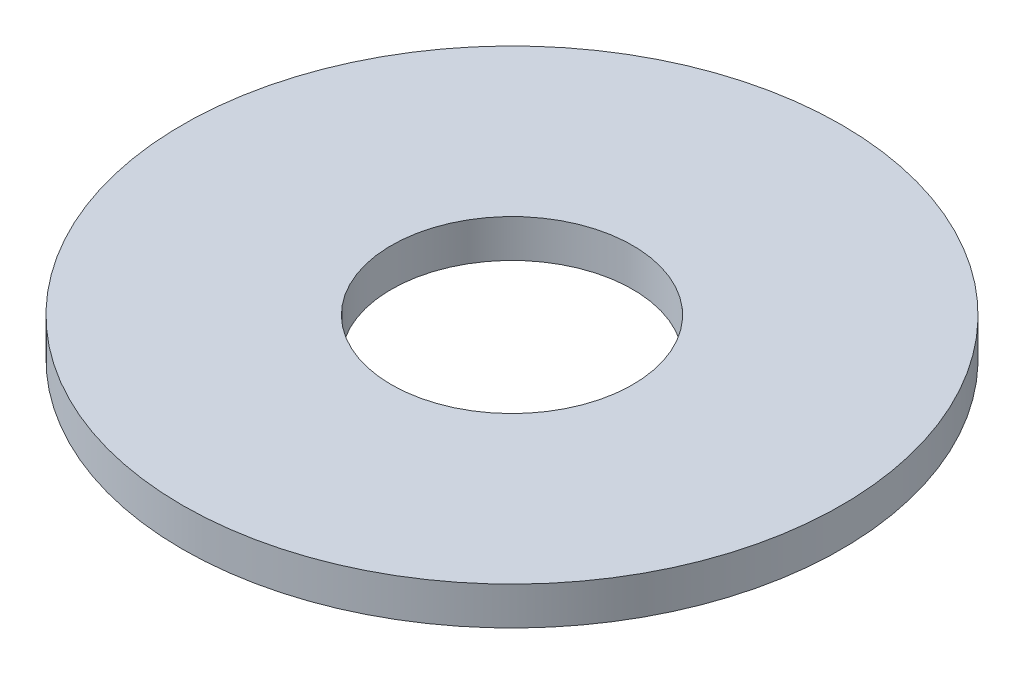
ISO-10303-21;
HEADER;
FILE_DESCRIPTION(('STEP AP214'),'2;1');
FILE_NAME('part.step','',(''),(''),'','','');
FILE_SCHEMA(('AUTOMOTIVE_DESIGN { 1 0 10303 214 1 1 1 1 }'));
ENDSEC;
DATA;
#1=APPLICATION_CONTEXT('core data for automotive mechanical design processes');
#2=APPLICATION_PROTOCOL_DEFINITION('international standard','automotive_design',2000,#1);
#3=PRODUCT_CONTEXT('',#1,'mechanical');
#4=PRODUCT('Part','Part','',(#3));
#5=PRODUCT_RELATED_PRODUCT_CATEGORY('part','',(#4));
#6=PRODUCT_DEFINITION_FORMATION('','',#4);
#7=PRODUCT_DEFINITION_CONTEXT('part definition',#1,'design');
#8=PRODUCT_DEFINITION('design','',#6,#7);
#9=PRODUCT_DEFINITION_SHAPE('','',#8);
#10=(LENGTH_UNIT() NAMED_UNIT(*) SI_UNIT(.MILLI.,.METRE.));
#11=(NAMED_UNIT(*) PLANE_ANGLE_UNIT() SI_UNIT($,.RADIAN.));
#12=(NAMED_UNIT(*) SI_UNIT($,.STERADIAN.) SOLID_ANGLE_UNIT());
#13=UNCERTAINTY_MEASURE_WITH_UNIT(LENGTH_MEASURE(1.E-05),#10,'distance_accuracy_value','');
#14=(GEOMETRIC_REPRESENTATION_CONTEXT(3) GLOBAL_UNCERTAINTY_ASSIGNED_CONTEXT((#13)) GLOBAL_UNIT_ASSIGNED_CONTEXT((#10,
#11,#12)) REPRESENTATION_CONTEXT('',''));
#15=CARTESIAN_POINT('',(0.,0.,0.));
#16=DIRECTION('',(0.,0.,1.));
#17=DIRECTION('',(1.,0.,0.));
#18=AXIS2_PLACEMENT_3D('',#15,#16,#17);
#19=CARTESIAN_POINT('',(0.,0.75,0.));
#20=DIRECTION('',(0.,1.,0.));
#21=DIRECTION('',(0.,0.,1.));
#22=AXIS2_PLACEMENT_3D('',#19,#20,#21);
#23=PLANE('',#22);
#24=CARTESIAN_POINT('',(0.,0.75,0.));
#25=DIRECTION('',(0.,1.,0.));
#26=DIRECTION('',(0.,0.,1.));
#27=AXIS2_PLACEMENT_3D('',#24,#25,#26);
#28=CIRCLE('',#27,13.);
#29=CARTESIAN_POINT('',(0.,0.75,13.));
#30=VERTEX_POINT('',#29);
#31=EDGE_CURVE('E10',#30,#30,#28,.T.);
#32=ORIENTED_EDGE('',*,*,#31,.T.);
#33=EDGE_LOOP('',(#32));
#34=FACE_BOUND('',#33,.T.);
#35=CARTESIAN_POINT('',(0.,0.75,0.));
#36=DIRECTION('',(0.,1.,0.));
#37=DIRECTION('',(0.,0.,1.));
#38=AXIS2_PLACEMENT_3D('',#35,#36,#37);
#39=CIRCLE('',#38,4.76);
#40=CARTESIAN_POINT('',(0.,0.75,4.76));
#41=VERTEX_POINT('',#40);
#42=EDGE_CURVE('E43',#41,#41,#39,.T.);
#43=ORIENTED_EDGE('',*,*,#42,.F.);
#44=EDGE_LOOP('',(#43));
#45=FACE_BOUND('',#44,.T.);
#46=ADVANCED_FACE('F32',(#34,#45),#23,.T.);
#47=CARTESIAN_POINT('',(0.,-0.75,0.));
#48=DIRECTION('',(0.,1.,0.));
#49=DIRECTION('',(0.,0.,1.));
#50=AXIS2_PLACEMENT_3D('',#47,#48,#49);
#51=PLANE('',#50);
#52=CARTESIAN_POINT('',(0.,-0.75,0.));
#53=DIRECTION('',(0.,1.,0.));
#54=DIRECTION('',(0.,0.,1.));
#55=AXIS2_PLACEMENT_3D('',#52,#53,#54);
#56=CIRCLE('',#55,13.);
#57=CARTESIAN_POINT('',(0.,-0.75,13.));
#58=VERTEX_POINT('',#57);
#59=EDGE_CURVE('E36',#58,#58,#56,.T.);
#60=ORIENTED_EDGE('',*,*,#59,.F.);
#61=EDGE_LOOP('',(#60));
#62=FACE_BOUND('',#61,.T.);
#63=CARTESIAN_POINT('',(0.,-0.75,0.));
#64=DIRECTION('',(0.,1.,0.));
#65=DIRECTION('',(0.,0.,1.));
#66=AXIS2_PLACEMENT_3D('',#63,#64,#65);
#67=CIRCLE('',#66,4.76);
#68=CARTESIAN_POINT('',(0.,-0.75,4.76));
#69=VERTEX_POINT('',#68);
#70=EDGE_CURVE('E45',#69,#69,#67,.T.);
#71=ORIENTED_EDGE('',*,*,#70,.T.);
#72=EDGE_LOOP('',(#71));
#73=FACE_BOUND('',#72,.T.);
#74=ADVANCED_FACE('F55',(#62,#73),#51,.F.);
#75=CARTESIAN_POINT('',(0.,0.75,0.));
#76=DIRECTION('',(0.,-1.,0.));
#77=DIRECTION('',(0.,0.,-1.));
#78=AXIS2_PLACEMENT_3D('',#75,#76,#77);
#79=CYLINDRICAL_SURFACE('',#78,13.);
#80=ORIENTED_EDGE('',*,*,#31,.F.);
#81=EDGE_LOOP('',(#80));
#82=FACE_BOUND('',#81,.T.);
#83=ORIENTED_EDGE('',*,*,#59,.T.);
#84=EDGE_LOOP('',(#83));
#85=FACE_BOUND('',#84,.T.);
#86=ADVANCED_FACE('F34',(#82,#85),#79,.T.);
#87=CARTESIAN_POINT('',(0.,0.75,0.));
#88=DIRECTION('',(0.,-1.,0.));
#89=DIRECTION('',(0.,0.,-1.));
#90=AXIS2_PLACEMENT_3D('',#87,#88,#89);
#91=CYLINDRICAL_SURFACE('',#90,4.76);
#92=ORIENTED_EDGE('',*,*,#42,.T.);
#93=EDGE_LOOP('',(#92));
#94=FACE_BOUND('',#93,.T.);
#95=ORIENTED_EDGE('',*,*,#70,.F.);
#96=EDGE_LOOP('',(#95));
#97=FACE_BOUND('',#96,.T.);
#98=ADVANCED_FACE('F51',(#94,#97),#91,.F.);
#99=CLOSED_SHELL('',(#46,#74,#86,#98));
#100=MANIFOLD_SOLID_BREP('B2',#99);
#101=ADVANCED_BREP_SHAPE_REPRESENTATION('',(#18,#100),#14);
#102=SHAPE_DEFINITION_REPRESENTATION(#9,#101);
ENDSEC;
END-ISO-10303-21;
